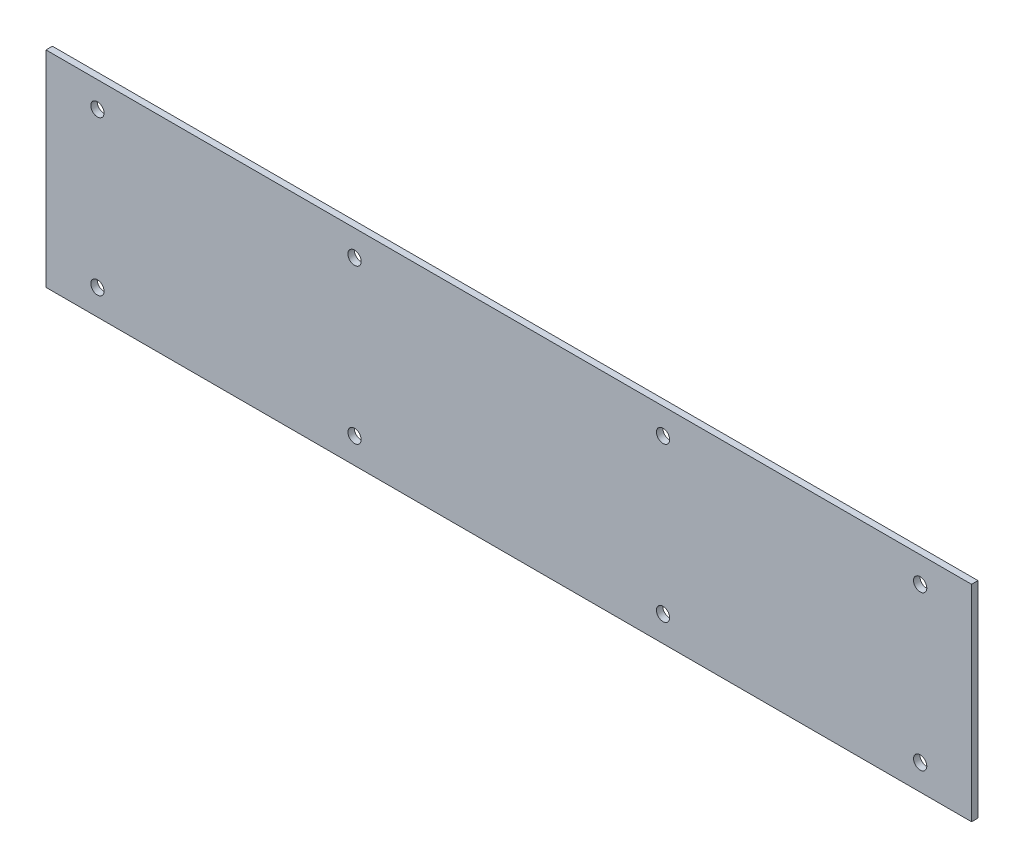
ISO-10303-21;
HEADER;
FILE_DESCRIPTION(('STEP AP214'),'2;1');
FILE_NAME('part.step','',(''),(''),'','','');
FILE_SCHEMA(('AUTOMOTIVE_DESIGN { 1 0 10303 214 1 1 1 1 }'));
ENDSEC;
DATA;
#1=APPLICATION_CONTEXT('core data for automotive mechanical design processes');
#2=APPLICATION_PROTOCOL_DEFINITION('international standard','automotive_design',2000,#1);
#3=PRODUCT_CONTEXT('',#1,'mechanical');
#4=PRODUCT('Part','Part','',(#3));
#5=PRODUCT_RELATED_PRODUCT_CATEGORY('part','',(#4));
#6=PRODUCT_DEFINITION_FORMATION('','',#4);
#7=PRODUCT_DEFINITION_CONTEXT('part definition',#1,'design');
#8=PRODUCT_DEFINITION('design','',#6,#7);
#9=PRODUCT_DEFINITION_SHAPE('','',#8);
#10=(LENGTH_UNIT() NAMED_UNIT(*) SI_UNIT(.MILLI.,.METRE.));
#11=(NAMED_UNIT(*) PLANE_ANGLE_UNIT() SI_UNIT($,.RADIAN.));
#12=(NAMED_UNIT(*) SI_UNIT($,.STERADIAN.) SOLID_ANGLE_UNIT());
#13=UNCERTAINTY_MEASURE_WITH_UNIT(LENGTH_MEASURE(1.E-05),#10,'distance_accuracy_value','');
#14=(GEOMETRIC_REPRESENTATION_CONTEXT(3) GLOBAL_UNCERTAINTY_ASSIGNED_CONTEXT((#13)) GLOBAL_UNIT_ASSIGNED_CONTEXT((#10,
#11,#12)) REPRESENTATION_CONTEXT('',''));
#15=CARTESIAN_POINT('',(0.,0.,0.));
#16=DIRECTION('',(0.,0.,1.));
#17=DIRECTION('',(1.,0.,0.));
#18=AXIS2_PLACEMENT_3D('',#15,#16,#17);
#19=CARTESIAN_POINT('',(127.,0.,0.));
#20=DIRECTION('',(1.,0.,0.));
#21=DIRECTION('',(0.,0.,-1.));
#22=AXIS2_PLACEMENT_3D('',#19,#20,#21);
#23=PLANE('',#22);
#24=DIRECTION('',(0.,1.,0.));
#25=VECTOR('',#24,1.);
#26=CARTESIAN_POINT('',(127.,76.2,3.175));
#27=LINE('',#26,#25);
#28=CARTESIAN_POINT('',(127.,0.,3.175));
#29=VERTEX_POINT('',#28);
#30=CARTESIAN_POINT('',(127.,101.6,3.175));
#31=VERTEX_POINT('',#30);
#32=EDGE_CURVE('E97',#29,#31,#27,.T.);
#33=ORIENTED_EDGE('',*,*,#32,.T.);
#34=DIRECTION('',(0.,0.,1.));
#35=VECTOR('',#34,1.);
#36=CARTESIAN_POINT('',(127.,101.6,0.));
#37=LINE('',#36,#35);
#38=CARTESIAN_POINT('',(127.,101.6,0.));
#39=VERTEX_POINT('',#38);
#40=EDGE_CURVE('E61',#39,#31,#37,.T.);
#41=ORIENTED_EDGE('',*,*,#40,.F.);
#42=DIRECTION('',(0.,-1.,0.));
#43=VECTOR('',#42,1.);
#44=CARTESIAN_POINT('',(127.,80.6674906682584,0.));
#45=LINE('',#44,#43);
#46=CARTESIAN_POINT('',(127.,0.,0.));
#47=VERTEX_POINT('',#46);
#48=EDGE_CURVE('E48',#39,#47,#45,.T.);
#49=ORIENTED_EDGE('',*,*,#48,.T.);
#50=DIRECTION('',(0.,0.,-1.));
#51=VECTOR('',#50,1.);
#52=CARTESIAN_POINT('',(127.,0.,3.175));
#53=LINE('',#52,#51);
#54=EDGE_CURVE('E90',#29,#47,#53,.T.);
#55=ORIENTED_EDGE('',*,*,#54,.F.);
#56=EDGE_LOOP('',(#33,#41,#49,#55));
#57=FACE_BOUND('',#56,.T.);
#58=ADVANCED_FACE('F44',(#57),#23,.F.);
#59=CARTESIAN_POINT('',(584.2,0.,0.));
#60=DIRECTION('',(-1.,0.,0.));
#61=DIRECTION('',(0.,0.,1.));
#62=AXIS2_PLACEMENT_3D('',#59,#60,#61);
#63=PLANE('',#62);
#64=DIRECTION('',(0.,-1.,0.));
#65=VECTOR('',#64,1.);
#66=CARTESIAN_POINT('',(584.2,76.2,3.175));
#67=LINE('',#66,#65);
#68=CARTESIAN_POINT('',(584.2,101.6,3.175));
#69=VERTEX_POINT('',#68);
#70=CARTESIAN_POINT('',(584.2,0.,3.175));
#71=VERTEX_POINT('',#70);
#72=EDGE_CURVE('E101',#69,#71,#67,.T.);
#73=ORIENTED_EDGE('',*,*,#72,.T.);
#74=DIRECTION('',(0.,0.,1.));
#75=VECTOR('',#74,1.);
#76=CARTESIAN_POINT('',(584.2,0.,3.175));
#77=LINE('',#76,#75);
#78=CARTESIAN_POINT('',(584.2,0.,0.));
#79=VERTEX_POINT('',#78);
#80=EDGE_CURVE('E96',#79,#71,#77,.T.);
#81=ORIENTED_EDGE('',*,*,#80,.F.);
#82=DIRECTION('',(0.,1.,0.));
#83=VECTOR('',#82,1.);
#84=CARTESIAN_POINT('',(584.2,80.6674906682584,0.));
#85=LINE('',#84,#83);
#86=CARTESIAN_POINT('',(584.2,101.6,0.));
#87=VERTEX_POINT('',#86);
#88=EDGE_CURVE('E102',#79,#87,#85,.T.);
#89=ORIENTED_EDGE('',*,*,#88,.T.);
#90=DIRECTION('',(0.,0.,-1.));
#91=VECTOR('',#90,1.);
#92=CARTESIAN_POINT('',(584.2,101.6,0.));
#93=LINE('',#92,#91);
#94=EDGE_CURVE('E69',#69,#87,#93,.T.);
#95=ORIENTED_EDGE('',*,*,#94,.F.);
#96=EDGE_LOOP('',(#73,#81,#89,#95));
#97=FACE_BOUND('',#96,.T.);
#98=ADVANCED_FACE('F117',(#97),#63,.F.);
#99=CARTESIAN_POINT('',(152.4,12.7,12.7));
#100=DIRECTION('',(0.,0.,-1.));
#101=DIRECTION('',(-1.,0.,0.));
#102=AXIS2_PLACEMENT_3D('',#99,#100,#101);
#103=CYLINDRICAL_SURFACE('',#102,3.27500000000002);
#104=CARTESIAN_POINT('',(152.4,12.7,0.));
#105=DIRECTION('',(0.,0.,-1.));
#106=DIRECTION('',(-1.,0.,0.));
#107=AXIS2_PLACEMENT_3D('',#104,#105,#106);
#108=CIRCLE('',#107,3.27500000000002);
#109=CARTESIAN_POINT('',(149.125,12.7,0.));
#110=VERTEX_POINT('',#109);
#111=EDGE_CURVE('E154',#110,#110,#108,.T.);
#112=ORIENTED_EDGE('',*,*,#111,.T.);
#113=EDGE_LOOP('',(#112));
#114=FACE_BOUND('',#113,.T.);
#115=CARTESIAN_POINT('',(152.4,12.7,3.175));
#116=DIRECTION('',(0.,0.,-1.));
#117=DIRECTION('',(-1.,0.,0.));
#118=AXIS2_PLACEMENT_3D('',#115,#116,#117);
#119=CIRCLE('',#118,3.27500000000002);
#120=CARTESIAN_POINT('',(149.125,12.7,3.175));
#121=VERTEX_POINT('',#120);
#122=EDGE_CURVE('E144',#121,#121,#119,.T.);
#123=ORIENTED_EDGE('',*,*,#122,.F.);
#124=EDGE_LOOP('',(#123));
#125=FACE_BOUND('',#124,.T.);
#126=ADVANCED_FACE('F187',(#114,#125),#103,.F.);
#127=CARTESIAN_POINT('',(558.8,12.7,12.7));
#128=DIRECTION('',(0.,0.,-1.));
#129=DIRECTION('',(-1.,0.,0.));
#130=AXIS2_PLACEMENT_3D('',#127,#128,#129);
#131=CYLINDRICAL_SURFACE('',#130,3.27500000000002);
#132=CARTESIAN_POINT('',(558.8,12.7,0.));
#133=DIRECTION('',(0.,0.,-1.));
#134=DIRECTION('',(-1.,0.,0.));
#135=AXIS2_PLACEMENT_3D('',#132,#133,#134);
#136=CIRCLE('',#135,3.27500000000002);
#137=CARTESIAN_POINT('',(555.525,12.7,0.));
#138=VERTEX_POINT('',#137);
#139=EDGE_CURVE('E151',#138,#138,#136,.T.);
#140=ORIENTED_EDGE('',*,*,#139,.T.);
#141=EDGE_LOOP('',(#140));
#142=FACE_BOUND('',#141,.T.);
#143=CARTESIAN_POINT('',(558.8,12.7,3.175));
#144=DIRECTION('',(0.,0.,-1.));
#145=DIRECTION('',(-1.,0.,0.));
#146=AXIS2_PLACEMENT_3D('',#143,#144,#145);
#147=CIRCLE('',#146,3.27500000000002);
#148=CARTESIAN_POINT('',(555.525,12.7,3.175));
#149=VERTEX_POINT('',#148);
#150=EDGE_CURVE('E141',#149,#149,#147,.T.);
#151=ORIENTED_EDGE('',*,*,#150,.F.);
#152=EDGE_LOOP('',(#151));
#153=FACE_BOUND('',#152,.T.);
#154=ADVANCED_FACE('F190',(#142,#153),#131,.F.);
#155=CARTESIAN_POINT('',(152.4,88.9,12.7));
#156=DIRECTION('',(0.,0.,-1.));
#157=DIRECTION('',(-1.,0.,0.));
#158=AXIS2_PLACEMENT_3D('',#155,#156,#157);
#159=CYLINDRICAL_SURFACE('',#158,3.27500000000002);
#160=CARTESIAN_POINT('',(152.4,88.9,0.));
#161=DIRECTION('',(0.,0.,-1.));
#162=DIRECTION('',(-1.,0.,0.));
#163=AXIS2_PLACEMENT_3D('',#160,#161,#162);
#164=CIRCLE('',#163,3.27500000000002);
#165=CARTESIAN_POINT('',(149.125,88.9,0.));
#166=VERTEX_POINT('',#165);
#167=EDGE_CURVE('E148',#166,#166,#164,.T.);
#168=ORIENTED_EDGE('',*,*,#167,.T.);
#169=EDGE_LOOP('',(#168));
#170=FACE_BOUND('',#169,.T.);
#171=CARTESIAN_POINT('',(152.4,88.9,3.175));
#172=DIRECTION('',(0.,0.,-1.));
#173=DIRECTION('',(-1.,0.,0.));
#174=AXIS2_PLACEMENT_3D('',#171,#172,#173);
#175=CIRCLE('',#174,3.27500000000002);
#176=CARTESIAN_POINT('',(149.125,88.9,3.175));
#177=VERTEX_POINT('',#176);
#178=EDGE_CURVE('E138',#177,#177,#175,.T.);
#179=ORIENTED_EDGE('',*,*,#178,.F.);
#180=EDGE_LOOP('',(#179));
#181=FACE_BOUND('',#180,.T.);
#182=ADVANCED_FACE('F224',(#170,#181),#159,.F.);
#183=CARTESIAN_POINT('',(558.8,88.9,12.7));
#184=DIRECTION('',(0.,0.,-1.));
#185=DIRECTION('',(-1.,0.,0.));
#186=AXIS2_PLACEMENT_3D('',#183,#184,#185);
#187=CYLINDRICAL_SURFACE('',#186,3.27500000000002);
#188=CARTESIAN_POINT('',(558.8,88.9,0.));
#189=DIRECTION('',(0.,0.,-1.));
#190=DIRECTION('',(-1.,0.,0.));
#191=AXIS2_PLACEMENT_3D('',#188,#189,#190);
#192=CIRCLE('',#191,3.27500000000002);
#193=CARTESIAN_POINT('',(555.525,88.9,0.));
#194=VERTEX_POINT('',#193);
#195=EDGE_CURVE('E147',#194,#194,#192,.T.);
#196=ORIENTED_EDGE('',*,*,#195,.T.);
#197=EDGE_LOOP('',(#196));
#198=FACE_BOUND('',#197,.T.);
#199=CARTESIAN_POINT('',(558.8,88.9,3.175));
#200=DIRECTION('',(0.,0.,-1.));
#201=DIRECTION('',(-1.,0.,0.));
#202=AXIS2_PLACEMENT_3D('',#199,#200,#201);
#203=CIRCLE('',#202,3.27500000000002);
#204=CARTESIAN_POINT('',(555.525,88.9,3.175));
#205=VERTEX_POINT('',#204);
#206=EDGE_CURVE('E135',#205,#205,#203,.T.);
#207=ORIENTED_EDGE('',*,*,#206,.F.);
#208=EDGE_LOOP('',(#207));
#209=FACE_BOUND('',#208,.T.);
#210=ADVANCED_FACE('F213',(#198,#209),#187,.F.);
#211=CARTESIAN_POINT('',(279.4,12.6999999999991,12.7));
#212=DIRECTION('',(0.,0.,-1.));
#213=DIRECTION('',(-1.,0.,0.));
#214=AXIS2_PLACEMENT_3D('',#211,#212,#213);
#215=CYLINDRICAL_SURFACE('',#214,3.27500000000002);
#216=CARTESIAN_POINT('',(279.4,12.6999999999991,0.));
#217=DIRECTION('',(0.,0.,-1.));
#218=DIRECTION('',(-1.,0.,0.));
#219=AXIS2_PLACEMENT_3D('',#216,#217,#218);
#220=CIRCLE('',#219,3.27500000000002);
#221=CARTESIAN_POINT('',(276.125,12.6999999999991,0.));
#222=VERTEX_POINT('',#221);
#223=EDGE_CURVE('E118',#222,#222,#220,.T.);
#224=ORIENTED_EDGE('',*,*,#223,.T.);
#225=EDGE_LOOP('',(#224));
#226=FACE_BOUND('',#225,.T.);
#227=CARTESIAN_POINT('',(279.4,12.6999999999991,3.175));
#228=DIRECTION('',(0.,0.,-1.));
#229=DIRECTION('',(-1.,0.,0.));
#230=AXIS2_PLACEMENT_3D('',#227,#228,#229);
#231=CIRCLE('',#230,3.27500000000002);
#232=CARTESIAN_POINT('',(276.125,12.6999999999991,3.175));
#233=VERTEX_POINT('',#232);
#234=EDGE_CURVE('E132',#233,#233,#231,.T.);
#235=ORIENTED_EDGE('',*,*,#234,.F.);
#236=EDGE_LOOP('',(#235));
#237=FACE_BOUND('',#236,.T.);
#238=ADVANCED_FACE('F209',(#226,#237),#215,.F.);
#239=CARTESIAN_POINT('',(431.8,88.9,12.7));
#240=DIRECTION('',(0.,0.,-1.));
#241=DIRECTION('',(-1.,0.,0.));
#242=AXIS2_PLACEMENT_3D('',#239,#240,#241);
#243=CYLINDRICAL_SURFACE('',#242,3.27500000000002);
#244=CARTESIAN_POINT('',(431.8,88.9,0.));
#245=DIRECTION('',(0.,0.,-1.));
#246=DIRECTION('',(-1.,0.,0.));
#247=AXIS2_PLACEMENT_3D('',#244,#245,#246);
#248=CIRCLE('',#247,3.27500000000002);
#249=CARTESIAN_POINT('',(428.525,88.9,0.));
#250=VERTEX_POINT('',#249);
#251=EDGE_CURVE('E157',#250,#250,#248,.T.);
#252=ORIENTED_EDGE('',*,*,#251,.T.);
#253=EDGE_LOOP('',(#252));
#254=FACE_BOUND('',#253,.T.);
#255=CARTESIAN_POINT('',(431.8,88.9,3.175));
#256=DIRECTION('',(0.,0.,-1.));
#257=DIRECTION('',(-1.,0.,0.));
#258=AXIS2_PLACEMENT_3D('',#255,#256,#257);
#259=CIRCLE('',#258,3.27500000000002);
#260=CARTESIAN_POINT('',(428.525,88.9,3.175));
#261=VERTEX_POINT('',#260);
#262=EDGE_CURVE('E129',#261,#261,#259,.T.);
#263=ORIENTED_EDGE('',*,*,#262,.F.);
#264=EDGE_LOOP('',(#263));
#265=FACE_BOUND('',#264,.T.);
#266=ADVANCED_FACE('F212',(#254,#265),#243,.F.);
#267=CARTESIAN_POINT('',(431.8,12.7,12.7));
#268=DIRECTION('',(0.,0.,-1.));
#269=DIRECTION('',(-1.,0.,0.));
#270=AXIS2_PLACEMENT_3D('',#267,#268,#269);
#271=CYLINDRICAL_SURFACE('',#270,3.27500000000002);
#272=CARTESIAN_POINT('',(431.8,12.7,0.));
#273=DIRECTION('',(0.,0.,-1.));
#274=DIRECTION('',(-1.,0.,0.));
#275=AXIS2_PLACEMENT_3D('',#272,#273,#274);
#276=CIRCLE('',#275,3.27500000000002);
#277=CARTESIAN_POINT('',(428.525,12.7,0.));
#278=VERTEX_POINT('',#277);
#279=EDGE_CURVE('E162',#278,#278,#276,.T.);
#280=ORIENTED_EDGE('',*,*,#279,.T.);
#281=EDGE_LOOP('',(#280));
#282=FACE_BOUND('',#281,.T.);
#283=CARTESIAN_POINT('',(431.8,12.7,3.175));
#284=DIRECTION('',(0.,0.,-1.));
#285=DIRECTION('',(-1.,0.,0.));
#286=AXIS2_PLACEMENT_3D('',#283,#284,#285);
#287=CIRCLE('',#286,3.27500000000002);
#288=CARTESIAN_POINT('',(428.525,12.7,3.175));
#289=VERTEX_POINT('',#288);
#290=EDGE_CURVE('E126',#289,#289,#287,.T.);
#291=ORIENTED_EDGE('',*,*,#290,.F.);
#292=EDGE_LOOP('',(#291));
#293=FACE_BOUND('',#292,.T.);
#294=ADVANCED_FACE('F168',(#282,#293),#271,.F.);
#295=CARTESIAN_POINT('',(279.4,88.8999999999991,12.7));
#296=DIRECTION('',(0.,0.,-1.));
#297=DIRECTION('',(-1.,0.,0.));
#298=AXIS2_PLACEMENT_3D('',#295,#296,#297);
#299=CYLINDRICAL_SURFACE('',#298,3.27500000000002);
#300=CARTESIAN_POINT('',(279.4,88.8999999999991,0.));
#301=DIRECTION('',(0.,0.,-1.));
#302=DIRECTION('',(-1.,0.,0.));
#303=AXIS2_PLACEMENT_3D('',#300,#301,#302);
#304=CIRCLE('',#303,3.27500000000002);
#305=CARTESIAN_POINT('',(276.125,88.8999999999991,0.));
#306=VERTEX_POINT('',#305);
#307=EDGE_CURVE('E120',#306,#306,#304,.T.);
#308=ORIENTED_EDGE('',*,*,#307,.T.);
#309=EDGE_LOOP('',(#308));
#310=FACE_BOUND('',#309,.T.);
#311=CARTESIAN_POINT('',(279.4,88.8999999999991,3.175));
#312=DIRECTION('',(0.,0.,-1.));
#313=DIRECTION('',(-1.,0.,0.));
#314=AXIS2_PLACEMENT_3D('',#311,#312,#313);
#315=CIRCLE('',#314,3.27500000000002);
#316=CARTESIAN_POINT('',(276.125,88.8999999999991,3.175));
#317=VERTEX_POINT('',#316);
#318=EDGE_CURVE('E112',#317,#317,#315,.T.);
#319=ORIENTED_EDGE('',*,*,#318,.F.);
#320=EDGE_LOOP('',(#319));
#321=FACE_BOUND('',#320,.T.);
#322=ADVANCED_FACE('F199',(#310,#321),#299,.F.);
#323=CARTESIAN_POINT('',(0.,0.,3.175));
#324=DIRECTION('',(0.,1.,0.));
#325=DIRECTION('',(-1.,0.,0.));
#326=AXIS2_PLACEMENT_3D('',#323,#324,#325);
#327=PLANE('',#326);
#328=DIRECTION('',(1.,0.,0.));
#329=VECTOR('',#328,1.);
#330=CARTESIAN_POINT('',(0.,0.,3.175));
#331=LINE('',#330,#329);
#332=EDGE_CURVE('E11',#29,#71,#331,.T.);
#333=ORIENTED_EDGE('',*,*,#332,.F.);
#334=ORIENTED_EDGE('',*,*,#54,.T.);
#335=DIRECTION('',(1.,0.,0.));
#336=VECTOR('',#335,1.);
#337=CARTESIAN_POINT('',(0.,0.,0.));
#338=LINE('',#337,#336);
#339=EDGE_CURVE('E53',#47,#79,#338,.T.);
#340=ORIENTED_EDGE('',*,*,#339,.T.);
#341=ORIENTED_EDGE('',*,*,#80,.T.);
#342=EDGE_LOOP('',(#333,#334,#340,#341));
#343=FACE_BOUND('',#342,.T.);
#344=ADVANCED_FACE('F92',(#343),#327,.F.);
#345=CARTESIAN_POINT('',(-1.929,76.2,3.175));
#346=DIRECTION('',(0.,0.,1.));
#347=DIRECTION('',(1.,0.,0.));
#348=AXIS2_PLACEMENT_3D('',#345,#346,#347);
#349=PLANE('',#348);
#350=ORIENTED_EDGE('',*,*,#32,.F.);
#351=ORIENTED_EDGE('',*,*,#332,.T.);
#352=ORIENTED_EDGE('',*,*,#72,.F.);
#353=DIRECTION('',(1.,0.,0.));
#354=VECTOR('',#353,1.);
#355=CARTESIAN_POINT('',(609.6,101.6,3.175));
#356=LINE('',#355,#354);
#357=EDGE_CURVE('E108',#31,#69,#356,.T.);
#358=ORIENTED_EDGE('',*,*,#357,.F.);
#359=EDGE_LOOP('',(#350,#351,#352,#358));
#360=FACE_BOUND('',#359,.T.);
#361=ORIENTED_EDGE('',*,*,#318,.T.);
#362=EDGE_LOOP('',(#361));
#363=FACE_BOUND('',#362,.T.);
#364=ORIENTED_EDGE('',*,*,#290,.T.);
#365=EDGE_LOOP('',(#364));
#366=FACE_BOUND('',#365,.T.);
#367=ORIENTED_EDGE('',*,*,#262,.T.);
#368=EDGE_LOOP('',(#367));
#369=FACE_BOUND('',#368,.T.);
#370=ORIENTED_EDGE('',*,*,#234,.T.);
#371=EDGE_LOOP('',(#370));
#372=FACE_BOUND('',#371,.T.);
#373=ORIENTED_EDGE('',*,*,#206,.T.);
#374=EDGE_LOOP('',(#373));
#375=FACE_BOUND('',#374,.T.);
#376=ORIENTED_EDGE('',*,*,#178,.T.);
#377=EDGE_LOOP('',(#376));
#378=FACE_BOUND('',#377,.T.);
#379=ORIENTED_EDGE('',*,*,#150,.T.);
#380=EDGE_LOOP('',(#379));
#381=FACE_BOUND('',#380,.T.);
#382=ORIENTED_EDGE('',*,*,#122,.T.);
#383=EDGE_LOOP('',(#382));
#384=FACE_BOUND('',#383,.T.);
#385=ADVANCED_FACE('F173',(#360,#363,#366,#369,#372,#375,#378,#381,#384),#349,.T.);
#386=CARTESIAN_POINT('',(811.551998673353,80.6674906682584,0.));
#387=DIRECTION('',(0.,0.,-1.));
#388=DIRECTION('',(-1.,0.,0.));
#389=AXIS2_PLACEMENT_3D('',#386,#387,#388);
#390=PLANE('',#389);
#391=ORIENTED_EDGE('',*,*,#48,.F.);
#392=DIRECTION('',(1.,0.,0.));
#393=VECTOR('',#392,1.);
#394=CARTESIAN_POINT('',(-0.254,101.6,0.));
#395=LINE('',#394,#393);
#396=EDGE_CURVE('E106',#39,#87,#395,.T.);
#397=ORIENTED_EDGE('',*,*,#396,.T.);
#398=ORIENTED_EDGE('',*,*,#88,.F.);
#399=ORIENTED_EDGE('',*,*,#339,.F.);
#400=EDGE_LOOP('',(#391,#397,#398,#399));
#401=FACE_BOUND('',#400,.T.);
#402=ORIENTED_EDGE('',*,*,#307,.F.);
#403=EDGE_LOOP('',(#402));
#404=FACE_BOUND('',#403,.T.);
#405=ORIENTED_EDGE('',*,*,#279,.F.);
#406=EDGE_LOOP('',(#405));
#407=FACE_BOUND('',#406,.T.);
#408=ORIENTED_EDGE('',*,*,#251,.F.);
#409=EDGE_LOOP('',(#408));
#410=FACE_BOUND('',#409,.T.);
#411=ORIENTED_EDGE('',*,*,#223,.F.);
#412=EDGE_LOOP('',(#411));
#413=FACE_BOUND('',#412,.T.);
#414=ORIENTED_EDGE('',*,*,#195,.F.);
#415=EDGE_LOOP('',(#414));
#416=FACE_BOUND('',#415,.T.);
#417=ORIENTED_EDGE('',*,*,#167,.F.);
#418=EDGE_LOOP('',(#417));
#419=FACE_BOUND('',#418,.T.);
#420=ORIENTED_EDGE('',*,*,#139,.F.);
#421=EDGE_LOOP('',(#420));
#422=FACE_BOUND('',#421,.T.);
#423=ORIENTED_EDGE('',*,*,#111,.F.);
#424=EDGE_LOOP('',(#423));
#425=FACE_BOUND('',#424,.T.);
#426=ADVANCED_FACE('F103',(#401,#404,#407,#410,#413,#416,#419,#422,#425),#390,.T.);
#427=CARTESIAN_POINT('',(609.6,101.6,0.));
#428=DIRECTION('',(0.,-1.,0.));
#429=DIRECTION('',(0.,0.,-1.));
#430=AXIS2_PLACEMENT_3D('',#427,#428,#429);
#431=PLANE('',#430);
#432=ORIENTED_EDGE('',*,*,#396,.F.);
#433=ORIENTED_EDGE('',*,*,#40,.T.);
#434=ORIENTED_EDGE('',*,*,#357,.T.);
#435=ORIENTED_EDGE('',*,*,#94,.T.);
#436=EDGE_LOOP('',(#432,#433,#434,#435));
#437=FACE_BOUND('',#436,.T.);
#438=ADVANCED_FACE('F46',(#437),#431,.F.);
#439=CLOSED_SHELL('',(#58,#98,#126,#154,#182,#210,#238,#266,#294,#322,#344,#385,#426,#438));
#440=MANIFOLD_SOLID_BREP('B2',#439);
#441=ADVANCED_BREP_SHAPE_REPRESENTATION('',(#18,#440),#14);
#442=SHAPE_DEFINITION_REPRESENTATION(#9,#441);
ENDSEC;
END-ISO-10303-21;
